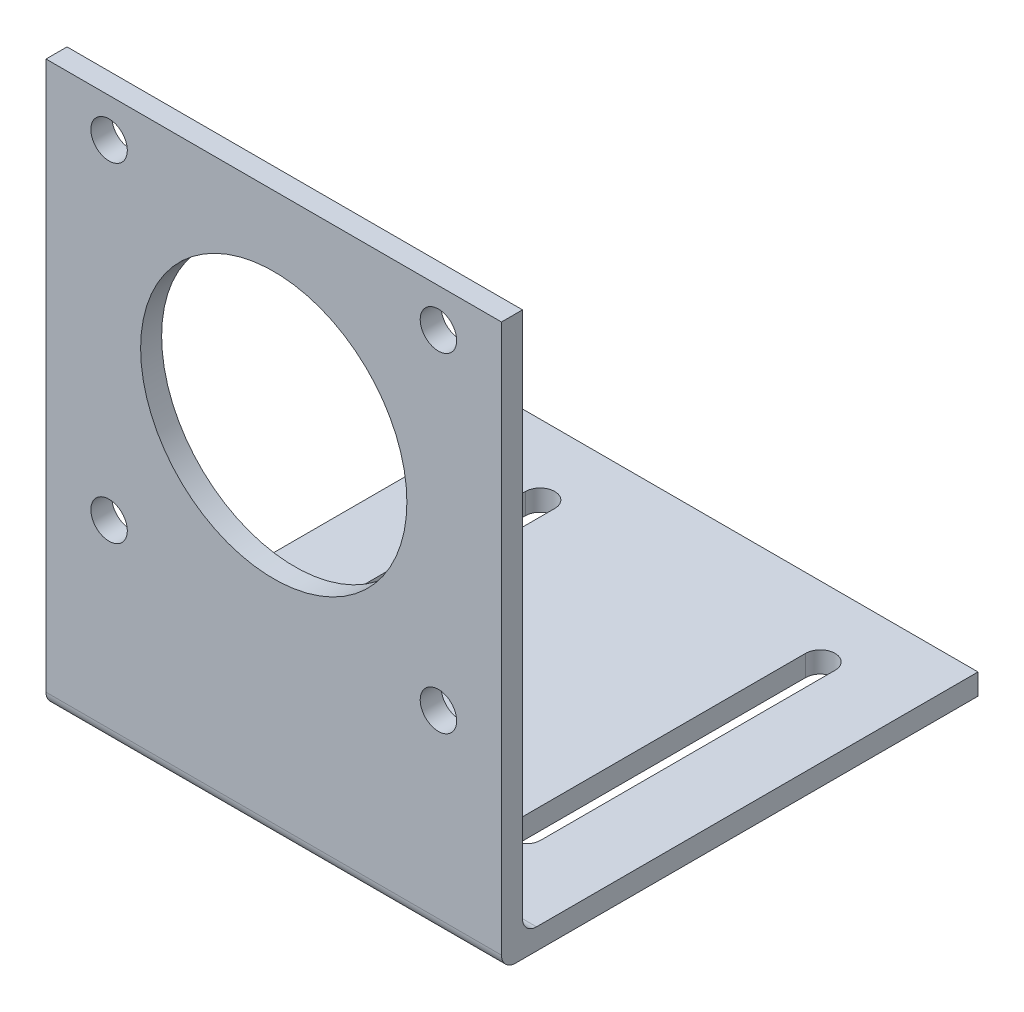
ISO-10303-21;
HEADER;
FILE_DESCRIPTION(('STEP AP214'),'2;1');
FILE_NAME('part.step','',(''),(''),'','','');
FILE_SCHEMA(('AUTOMOTIVE_DESIGN { 1 0 10303 214 1 1 1 1 }'));
ENDSEC;
DATA;
#1=APPLICATION_CONTEXT('core data for automotive mechanical design processes');
#2=APPLICATION_PROTOCOL_DEFINITION('international standard','automotive_design',2000,#1);
#3=PRODUCT_CONTEXT('',#1,'mechanical');
#4=PRODUCT('Part','Part','',(#3));
#5=PRODUCT_RELATED_PRODUCT_CATEGORY('part','',(#4));
#6=PRODUCT_DEFINITION_FORMATION('','',#4);
#7=PRODUCT_DEFINITION_CONTEXT('part definition',#1,'design');
#8=PRODUCT_DEFINITION('design','',#6,#7);
#9=PRODUCT_DEFINITION_SHAPE('','',#8);
#10=(LENGTH_UNIT() NAMED_UNIT(*) SI_UNIT(.MILLI.,.METRE.));
#11=(NAMED_UNIT(*) PLANE_ANGLE_UNIT() SI_UNIT($,.RADIAN.));
#12=(NAMED_UNIT(*) SI_UNIT($,.STERADIAN.) SOLID_ANGLE_UNIT());
#13=UNCERTAINTY_MEASURE_WITH_UNIT(LENGTH_MEASURE(1.E-05),#10,'distance_accuracy_value','');
#14=(GEOMETRIC_REPRESENTATION_CONTEXT(3) GLOBAL_UNCERTAINTY_ASSIGNED_CONTEXT((#13)) GLOBAL_UNIT_ASSIGNED_CONTEXT((#10,
#11,#12)) REPRESENTATION_CONTEXT('',''));
#15=CARTESIAN_POINT('',(0.,0.,0.));
#16=DIRECTION('',(0.,0.,1.));
#17=DIRECTION('',(1.,0.,0.));
#18=AXIS2_PLACEMENT_3D('',#15,#16,#17);
#19=CARTESIAN_POINT('',(65.,0.,0.));
#20=DIRECTION('',(0.,0.,1.));
#21=DIRECTION('',(1.,0.,0.));
#22=AXIS2_PLACEMENT_3D('',#19,#20,#21);
#23=PLANE('',#22);
#24=DIRECTION('',(0.,1.,0.));
#25=VECTOR('',#24,1.);
#26=CARTESIAN_POINT('',(0.,0.,0.));
#27=LINE('',#26,#25);
#28=CARTESIAN_POINT('',(0.,0.,0.));
#29=VERTEX_POINT('',#28);
#30=CARTESIAN_POINT('',(0.,3.,0.));
#31=VERTEX_POINT('',#30);
#32=EDGE_CURVE('E239',#29,#31,#27,.T.);
#33=ORIENTED_EDGE('',*,*,#32,.T.);
#34=DIRECTION('',(-1.,0.,0.));
#35=VECTOR('',#34,1.);
#36=CARTESIAN_POINT('',(65.,3.,0.));
#37=LINE('',#36,#35);
#38=CARTESIAN_POINT('',(65.,3.,0.));
#39=VERTEX_POINT('',#38);
#40=EDGE_CURVE('E11',#39,#31,#37,.T.);
#41=ORIENTED_EDGE('',*,*,#40,.F.);
#42=DIRECTION('',(0.,1.,0.));
#43=VECTOR('',#42,1.);
#44=CARTESIAN_POINT('',(65.,0.,0.));
#45=LINE('',#44,#43);
#46=CARTESIAN_POINT('',(65.,0.,0.));
#47=VERTEX_POINT('',#46);
#48=EDGE_CURVE('E249',#47,#39,#45,.T.);
#49=ORIENTED_EDGE('',*,*,#48,.F.);
#50=DIRECTION('',(-1.,0.,0.));
#51=VECTOR('',#50,1.);
#52=CARTESIAN_POINT('',(65.,0.,0.));
#53=LINE('',#52,#51);
#54=EDGE_CURVE('E275',#47,#29,#53,.T.);
#55=ORIENTED_EDGE('',*,*,#54,.T.);
#56=EDGE_LOOP('',(#33,#41,#49,#55));
#57=FACE_BOUND('',#56,.T.);
#58=ADVANCED_FACE('F39',(#57),#23,.F.);
#59=CARTESIAN_POINT('',(65.,3.,63.));
#60=DIRECTION('',(0.,-1.,0.));
#61=DIRECTION('',(0.,0.,-1.));
#62=AXIS2_PLACEMENT_3D('',#59,#60,#61);
#63=PLANE('',#62);
#64=DIRECTION('',(0.,0.,1.));
#65=VECTOR('',#64,1.);
#66=CARTESIAN_POINT('',(10.4,3.,52.));
#67=LINE('',#66,#65);
#68=CARTESIAN_POINT('',(10.4,3.,10.));
#69=VERTEX_POINT('',#68);
#70=CARTESIAN_POINT('',(10.4,3.,52.));
#71=VERTEX_POINT('',#70);
#72=EDGE_CURVE('E189',#69,#71,#67,.T.);
#73=ORIENTED_EDGE('',*,*,#72,.F.);
#74=CARTESIAN_POINT('',(12.5,3.,10.));
#75=DIRECTION('',(0.,1.,0.));
#76=DIRECTION('',(0.,0.,-1.));
#77=AXIS2_PLACEMENT_3D('',#74,#75,#76);
#78=CIRCLE('',#77,2.1);
#79=CARTESIAN_POINT('',(14.6,3.,10.));
#80=VERTEX_POINT('',#79);
#81=EDGE_CURVE('E54',#80,#69,#78,.T.);
#82=ORIENTED_EDGE('',*,*,#81,.F.);
#83=DIRECTION('',(0.,0.,-1.));
#84=VECTOR('',#83,1.);
#85=CARTESIAN_POINT('',(14.6,3.,52.));
#86=LINE('',#85,#84);
#87=CARTESIAN_POINT('',(14.6,3.,52.));
#88=VERTEX_POINT('',#87);
#89=EDGE_CURVE('E173',#88,#80,#86,.T.);
#90=ORIENTED_EDGE('',*,*,#89,.F.);
#91=CARTESIAN_POINT('',(12.5,3.,52.));
#92=DIRECTION('',(0.,1.,0.));
#93=DIRECTION('',(0.,0.,1.));
#94=AXIS2_PLACEMENT_3D('',#91,#92,#93);
#95=CIRCLE('',#94,2.1);
#96=EDGE_CURVE('E177',#71,#88,#95,.T.);
#97=ORIENTED_EDGE('',*,*,#96,.F.);
#98=EDGE_LOOP('',(#73,#82,#90,#97));
#99=FACE_BOUND('',#98,.T.);
#100=DIRECTION('',(0.,0.,-1.));
#101=VECTOR('',#100,1.);
#102=CARTESIAN_POINT('',(54.6,3.,52.));
#103=LINE('',#102,#101);
#104=CARTESIAN_POINT('',(54.6,3.,52.));
#105=VERTEX_POINT('',#104);
#106=CARTESIAN_POINT('',(54.6,3.,10.));
#107=VERTEX_POINT('',#106);
#108=EDGE_CURVE('E225',#105,#107,#103,.T.);
#109=ORIENTED_EDGE('',*,*,#108,.F.);
#110=CARTESIAN_POINT('',(52.5,3.,52.));
#111=DIRECTION('',(0.,1.,0.));
#112=DIRECTION('',(0.,0.,-1.));
#113=AXIS2_PLACEMENT_3D('',#110,#111,#112);
#114=CIRCLE('',#113,2.1);
#115=CARTESIAN_POINT('',(50.4,3.,52.));
#116=VERTEX_POINT('',#115);
#117=EDGE_CURVE('E199',#116,#105,#114,.T.);
#118=ORIENTED_EDGE('',*,*,#117,.F.);
#119=DIRECTION('',(0.,0.,1.));
#120=VECTOR('',#119,1.);
#121=CARTESIAN_POINT('',(50.4,3.,52.));
#122=LINE('',#121,#120);
#123=CARTESIAN_POINT('',(50.4,3.,10.));
#124=VERTEX_POINT('',#123);
#125=EDGE_CURVE('E210',#124,#116,#122,.T.);
#126=ORIENTED_EDGE('',*,*,#125,.F.);
#127=CARTESIAN_POINT('',(52.5,3.,10.));
#128=DIRECTION('',(0.,1.,0.));
#129=DIRECTION('',(0.,0.,1.));
#130=AXIS2_PLACEMENT_3D('',#127,#128,#129);
#131=CIRCLE('',#130,2.1);
#132=EDGE_CURVE('E229',#107,#124,#131,.T.);
#133=ORIENTED_EDGE('',*,*,#132,.F.);
#134=EDGE_LOOP('',(#109,#118,#126,#133));
#135=FACE_BOUND('',#134,.T.);
#136=DIRECTION('',(0.,0.,1.));
#137=VECTOR('',#136,1.);
#138=CARTESIAN_POINT('',(0.,3.,63.));
#139=LINE('',#138,#137);
#140=CARTESIAN_POINT('',(0.,3.,63.));
#141=VERTEX_POINT('',#140);
#142=EDGE_CURVE('E279',#31,#141,#139,.T.);
#143=ORIENTED_EDGE('',*,*,#142,.T.);
#144=DIRECTION('',(-1.,0.,0.));
#145=VECTOR('',#144,1.);
#146=CARTESIAN_POINT('',(65.,3.,63.));
#147=LINE('',#146,#145);
#148=CARTESIAN_POINT('',(65.,3.,63.));
#149=VERTEX_POINT('',#148);
#150=EDGE_CURVE('E47',#149,#141,#147,.T.);
#151=ORIENTED_EDGE('',*,*,#150,.F.);
#152=DIRECTION('',(0.,0.,1.));
#153=VECTOR('',#152,1.);
#154=CARTESIAN_POINT('',(65.,3.,63.));
#155=LINE('',#154,#153);
#156=EDGE_CURVE('E253',#39,#149,#155,.T.);
#157=ORIENTED_EDGE('',*,*,#156,.F.);
#158=ORIENTED_EDGE('',*,*,#40,.T.);
#159=EDGE_LOOP('',(#143,#151,#157,#158));
#160=FACE_BOUND('',#159,.T.);
#161=ADVANCED_FACE('F350',(#99,#135,#160),#63,.F.);
#162=CARTESIAN_POINT('',(65.,5.,63.));
#163=DIRECTION('',(-1.,0.,0.));
#164=DIRECTION('',(0.,0.,1.));
#165=AXIS2_PLACEMENT_3D('',#162,#163,#164);
#166=CYLINDRICAL_SURFACE('',#165,2.);
#167=CARTESIAN_POINT('',(0.,5.,63.));
#168=DIRECTION('',(-1.,0.,0.));
#169=DIRECTION('',(0.,0.,1.));
#170=AXIS2_PLACEMENT_3D('',#167,#168,#169);
#171=CIRCLE('',#170,2.);
#172=CARTESIAN_POINT('',(0.,5.00000000000001,65.));
#173=VERTEX_POINT('',#172);
#174=EDGE_CURVE('E282',#141,#173,#171,.T.);
#175=ORIENTED_EDGE('',*,*,#174,.T.);
#176=DIRECTION('',(-1.,0.,0.));
#177=VECTOR('',#176,1.);
#178=CARTESIAN_POINT('',(65.,5.00000000000001,65.));
#179=LINE('',#178,#177);
#180=CARTESIAN_POINT('',(65.,5.00000000000001,65.));
#181=VERTEX_POINT('',#180);
#182=EDGE_CURVE('E318',#181,#173,#179,.T.);
#183=ORIENTED_EDGE('',*,*,#182,.F.);
#184=CARTESIAN_POINT('',(65.,5.,63.));
#185=DIRECTION('',(-1.,0.,0.));
#186=DIRECTION('',(0.,0.,1.));
#187=AXIS2_PLACEMENT_3D('',#184,#185,#186);
#188=CIRCLE('',#187,2.);
#189=EDGE_CURVE('E257',#149,#181,#188,.T.);
#190=ORIENTED_EDGE('',*,*,#189,.F.);
#191=ORIENTED_EDGE('',*,*,#150,.T.);
#192=EDGE_LOOP('',(#175,#183,#190,#191));
#193=FACE_BOUND('',#192,.T.);
#194=ADVANCED_FACE('F327',(#193),#166,.F.);
#195=CARTESIAN_POINT('',(65.,80.25,65.));
#196=DIRECTION('',(0.,0.,1.));
#197=DIRECTION('',(1.,0.,0.));
#198=AXIS2_PLACEMENT_3D('',#195,#196,#197);
#199=PLANE('',#198);
#200=CARTESIAN_POINT('',(8.99999999999998,27.75,65.));
#201=DIRECTION('',(0.,0.,-1.));
#202=DIRECTION('',(-1.,0.,0.));
#203=AXIS2_PLACEMENT_3D('',#200,#201,#202);
#204=CIRCLE('',#203,2.6);
#205=CARTESIAN_POINT('',(6.39999999999998,27.75,65.));
#206=VERTEX_POINT('',#205);
#207=EDGE_CURVE('E392',#206,#206,#204,.T.);
#208=ORIENTED_EDGE('',*,*,#207,.F.);
#209=EDGE_LOOP('',(#208));
#210=FACE_BOUND('',#209,.T.);
#211=CARTESIAN_POINT('',(56.,27.75,65.));
#212=DIRECTION('',(0.,0.,-1.));
#213=DIRECTION('',(-1.,0.,0.));
#214=AXIS2_PLACEMENT_3D('',#211,#212,#213);
#215=CIRCLE('',#214,2.6);
#216=CARTESIAN_POINT('',(53.4,27.75,65.));
#217=VERTEX_POINT('',#216);
#218=EDGE_CURVE('E396',#217,#217,#215,.T.);
#219=ORIENTED_EDGE('',*,*,#218,.F.);
#220=EDGE_LOOP('',(#219));
#221=FACE_BOUND('',#220,.T.);
#222=CARTESIAN_POINT('',(56.,74.75,65.));
#223=DIRECTION('',(0.,0.,-1.));
#224=DIRECTION('',(-1.,0.,0.));
#225=AXIS2_PLACEMENT_3D('',#222,#223,#224);
#226=CIRCLE('',#225,2.6);
#227=CARTESIAN_POINT('',(53.4,74.75,65.));
#228=VERTEX_POINT('',#227);
#229=EDGE_CURVE('E400',#228,#228,#226,.T.);
#230=ORIENTED_EDGE('',*,*,#229,.F.);
#231=EDGE_LOOP('',(#230));
#232=FACE_BOUND('',#231,.T.);
#233=CARTESIAN_POINT('',(8.99999999999998,74.75,65.));
#234=DIRECTION('',(0.,0.,-1.));
#235=DIRECTION('',(-1.,0.,0.));
#236=AXIS2_PLACEMENT_3D('',#233,#234,#235);
#237=CIRCLE('',#236,2.6);
#238=CARTESIAN_POINT('',(6.39999999999998,74.75,65.));
#239=VERTEX_POINT('',#238);
#240=EDGE_CURVE('E404',#239,#239,#237,.T.);
#241=ORIENTED_EDGE('',*,*,#240,.F.);
#242=EDGE_LOOP('',(#241));
#243=FACE_BOUND('',#242,.T.);
#244=CARTESIAN_POINT('',(32.5,51.25,65.));
#245=DIRECTION('',(0.,0.,-1.));
#246=DIRECTION('',(-1.,0.,0.));
#247=AXIS2_PLACEMENT_3D('',#244,#245,#246);
#248=CIRCLE('',#247,19.);
#249=CARTESIAN_POINT('',(13.5,51.25,65.));
#250=VERTEX_POINT('',#249);
#251=EDGE_CURVE('E180',#250,#250,#248,.T.);
#252=ORIENTED_EDGE('',*,*,#251,.F.);
#253=EDGE_LOOP('',(#252));
#254=FACE_BOUND('',#253,.T.);
#255=DIRECTION('',(0.,1.,0.));
#256=VECTOR('',#255,1.);
#257=CARTESIAN_POINT('',(0.,80.25,65.));
#258=LINE('',#257,#256);
#259=CARTESIAN_POINT('',(0.,80.25,65.));
#260=VERTEX_POINT('',#259);
#261=EDGE_CURVE('E285',#173,#260,#258,.T.);
#262=ORIENTED_EDGE('',*,*,#261,.T.);
#263=DIRECTION('',(-1.,0.,0.));
#264=VECTOR('',#263,1.);
#265=CARTESIAN_POINT('',(65.,80.25,65.));
#266=LINE('',#265,#264);
#267=CARTESIAN_POINT('',(65.,80.25,65.));
#268=VERTEX_POINT('',#267);
#269=EDGE_CURVE('E314',#268,#260,#266,.T.);
#270=ORIENTED_EDGE('',*,*,#269,.F.);
#271=DIRECTION('',(0.,1.,0.));
#272=VECTOR('',#271,1.);
#273=CARTESIAN_POINT('',(65.,80.25,65.));
#274=LINE('',#273,#272);
#275=EDGE_CURVE('E260',#181,#268,#274,.T.);
#276=ORIENTED_EDGE('',*,*,#275,.F.);
#277=ORIENTED_EDGE('',*,*,#182,.T.);
#278=EDGE_LOOP('',(#262,#270,#276,#277));
#279=FACE_BOUND('',#278,.T.);
#280=ADVANCED_FACE('F338',(#210,#221,#232,#243,#254,#279),#199,.F.);
#281=CARTESIAN_POINT('',(65.,80.25,68.));
#282=DIRECTION('',(0.,-1.,0.));
#283=DIRECTION('',(0.,0.,-1.));
#284=AXIS2_PLACEMENT_3D('',#281,#282,#283);
#285=PLANE('',#284);
#286=DIRECTION('',(0.,0.,1.));
#287=VECTOR('',#286,1.);
#288=CARTESIAN_POINT('',(0.,80.25,68.));
#289=LINE('',#288,#287);
#290=CARTESIAN_POINT('',(0.,80.25,68.));
#291=VERTEX_POINT('',#290);
#292=EDGE_CURVE('E288',#260,#291,#289,.T.);
#293=ORIENTED_EDGE('',*,*,#292,.T.);
#294=DIRECTION('',(-1.,0.,0.));
#295=VECTOR('',#294,1.);
#296=CARTESIAN_POINT('',(65.,80.25,68.));
#297=LINE('',#296,#295);
#298=CARTESIAN_POINT('',(65.,80.25,68.));
#299=VERTEX_POINT('',#298);
#300=EDGE_CURVE('E310',#299,#291,#297,.T.);
#301=ORIENTED_EDGE('',*,*,#300,.F.);
#302=DIRECTION('',(0.,0.,1.));
#303=VECTOR('',#302,1.);
#304=CARTESIAN_POINT('',(65.,80.25,68.));
#305=LINE('',#304,#303);
#306=EDGE_CURVE('E263',#268,#299,#305,.T.);
#307=ORIENTED_EDGE('',*,*,#306,.F.);
#308=ORIENTED_EDGE('',*,*,#269,.T.);
#309=EDGE_LOOP('',(#293,#301,#307,#308));
#310=FACE_BOUND('',#309,.T.);
#311=ADVANCED_FACE('F342',(#310),#285,.F.);
#312=CARTESIAN_POINT('',(65.,2.00000000000001,68.));
#313=DIRECTION('',(0.,0.,-1.));
#314=DIRECTION('',(-1.,0.,0.));
#315=AXIS2_PLACEMENT_3D('',#312,#313,#314);
#316=PLANE('',#315);
#317=CARTESIAN_POINT('',(8.99999999999998,27.75,68.));
#318=DIRECTION('',(0.,0.,-1.));
#319=DIRECTION('',(-1.,0.,0.));
#320=AXIS2_PLACEMENT_3D('',#317,#318,#319);
#321=CIRCLE('',#320,2.6);
#322=CARTESIAN_POINT('',(6.39999999999998,27.75,68.));
#323=VERTEX_POINT('',#322);
#324=EDGE_CURVE('E429',#323,#323,#321,.T.);
#325=ORIENTED_EDGE('',*,*,#324,.T.);
#326=EDGE_LOOP('',(#325));
#327=FACE_BOUND('',#326,.T.);
#328=CARTESIAN_POINT('',(56.,27.75,68.));
#329=DIRECTION('',(0.,0.,-1.));
#330=DIRECTION('',(-1.,0.,0.));
#331=AXIS2_PLACEMENT_3D('',#328,#329,#330);
#332=CIRCLE('',#331,2.6);
#333=CARTESIAN_POINT('',(53.4,27.75,68.));
#334=VERTEX_POINT('',#333);
#335=EDGE_CURVE('E423',#334,#334,#332,.T.);
#336=ORIENTED_EDGE('',*,*,#335,.T.);
#337=EDGE_LOOP('',(#336));
#338=FACE_BOUND('',#337,.T.);
#339=CARTESIAN_POINT('',(56.,74.75,68.));
#340=DIRECTION('',(0.,0.,-1.));
#341=DIRECTION('',(-1.,0.,0.));
#342=AXIS2_PLACEMENT_3D('',#339,#340,#341);
#343=CIRCLE('',#342,2.6);
#344=CARTESIAN_POINT('',(53.4,74.75,68.));
#345=VERTEX_POINT('',#344);
#346=EDGE_CURVE('E418',#345,#345,#343,.T.);
#347=ORIENTED_EDGE('',*,*,#346,.T.);
#348=EDGE_LOOP('',(#347));
#349=FACE_BOUND('',#348,.T.);
#350=CARTESIAN_POINT('',(8.99999999999998,74.75,68.));
#351=DIRECTION('',(0.,0.,-1.));
#352=DIRECTION('',(-1.,0.,0.));
#353=AXIS2_PLACEMENT_3D('',#350,#351,#352);
#354=CIRCLE('',#353,2.6);
#355=CARTESIAN_POINT('',(6.39999999999998,74.75,68.));
#356=VERTEX_POINT('',#355);
#357=EDGE_CURVE('E409',#356,#356,#354,.T.);
#358=ORIENTED_EDGE('',*,*,#357,.T.);
#359=EDGE_LOOP('',(#358));
#360=FACE_BOUND('',#359,.T.);
#361=CARTESIAN_POINT('',(32.5,51.25,68.));
#362=DIRECTION('',(0.,0.,-1.));
#363=DIRECTION('',(-1.,0.,0.));
#364=AXIS2_PLACEMENT_3D('',#361,#362,#363);
#365=CIRCLE('',#364,19.);
#366=CARTESIAN_POINT('',(13.5,51.25,68.));
#367=VERTEX_POINT('',#366);
#368=EDGE_CURVE('E190',#367,#367,#365,.T.);
#369=ORIENTED_EDGE('',*,*,#368,.T.);
#370=EDGE_LOOP('',(#369));
#371=FACE_BOUND('',#370,.T.);
#372=DIRECTION('',(0.,-1.,0.));
#373=VECTOR('',#372,1.);
#374=CARTESIAN_POINT('',(0.,2.00000000000001,68.));
#375=LINE('',#374,#373);
#376=CARTESIAN_POINT('',(0.,2.00000000000001,68.));
#377=VERTEX_POINT('',#376);
#378=EDGE_CURVE('E291',#291,#377,#375,.T.);
#379=ORIENTED_EDGE('',*,*,#378,.T.);
#380=DIRECTION('',(-1.,0.,0.));
#381=VECTOR('',#380,1.);
#382=CARTESIAN_POINT('',(65.,2.00000000000001,68.));
#383=LINE('',#382,#381);
#384=CARTESIAN_POINT('',(65.,2.00000000000001,68.));
#385=VERTEX_POINT('',#384);
#386=EDGE_CURVE('E306',#385,#377,#383,.T.);
#387=ORIENTED_EDGE('',*,*,#386,.F.);
#388=DIRECTION('',(0.,-1.,0.));
#389=VECTOR('',#388,1.);
#390=CARTESIAN_POINT('',(65.,2.00000000000001,68.));
#391=LINE('',#390,#389);
#392=EDGE_CURVE('E266',#299,#385,#391,.T.);
#393=ORIENTED_EDGE('',*,*,#392,.F.);
#394=ORIENTED_EDGE('',*,*,#300,.T.);
#395=EDGE_LOOP('',(#379,#387,#393,#394));
#396=FACE_BOUND('',#395,.T.);
#397=ADVANCED_FACE('F362',(#327,#338,#349,#360,#371,#396),#316,.F.);
#398=CARTESIAN_POINT('',(65.,1.99999999999999,66.));
#399=DIRECTION('',(-1.,0.,0.));
#400=DIRECTION('',(0.,0.,1.));
#401=AXIS2_PLACEMENT_3D('',#398,#399,#400);
#402=CYLINDRICAL_SURFACE('',#401,2.);
#403=CARTESIAN_POINT('',(0.,1.99999999999999,66.));
#404=DIRECTION('',(1.,0.,0.));
#405=DIRECTION('',(0.,0.,1.));
#406=AXIS2_PLACEMENT_3D('',#403,#404,#405);
#407=CIRCLE('',#406,2.);
#408=CARTESIAN_POINT('',(0.,0.,66.));
#409=VERTEX_POINT('',#408);
#410=EDGE_CURVE('E294',#377,#409,#407,.T.);
#411=ORIENTED_EDGE('',*,*,#410,.T.);
#412=DIRECTION('',(-1.,0.,0.));
#413=VECTOR('',#412,1.);
#414=CARTESIAN_POINT('',(65.,0.,66.));
#415=LINE('',#414,#413);
#416=CARTESIAN_POINT('',(65.,0.,66.));
#417=VERTEX_POINT('',#416);
#418=EDGE_CURVE('E302',#417,#409,#415,.T.);
#419=ORIENTED_EDGE('',*,*,#418,.F.);
#420=CARTESIAN_POINT('',(65.,1.99999999999999,66.));
#421=DIRECTION('',(1.,0.,0.));
#422=DIRECTION('',(0.,0.,1.));
#423=AXIS2_PLACEMENT_3D('',#420,#421,#422);
#424=CIRCLE('',#423,2.);
#425=EDGE_CURVE('E269',#385,#417,#424,.T.);
#426=ORIENTED_EDGE('',*,*,#425,.F.);
#427=ORIENTED_EDGE('',*,*,#386,.T.);
#428=EDGE_LOOP('',(#411,#419,#426,#427));
#429=FACE_BOUND('',#428,.T.);
#430=ADVANCED_FACE('F360',(#429),#402,.T.);
#431=CARTESIAN_POINT('',(65.,0.,0.));
#432=DIRECTION('',(0.,1.,0.));
#433=DIRECTION('',(0.,0.,1.));
#434=AXIS2_PLACEMENT_3D('',#431,#432,#433);
#435=PLANE('',#434);
#436=DIRECTION('',(0.,0.,-1.));
#437=VECTOR('',#436,1.);
#438=CARTESIAN_POINT('',(14.6,0.,52.));
#439=LINE('',#438,#437);
#440=CARTESIAN_POINT('',(14.6,0.,52.));
#441=VERTEX_POINT('',#440);
#442=CARTESIAN_POINT('',(14.6,0.,10.));
#443=VERTEX_POINT('',#442);
#444=EDGE_CURVE('E161',#441,#443,#439,.T.);
#445=ORIENTED_EDGE('',*,*,#444,.T.);
#446=CARTESIAN_POINT('',(12.5,0.,10.));
#447=DIRECTION('',(0.,1.,0.));
#448=DIRECTION('',(0.,0.,-1.));
#449=AXIS2_PLACEMENT_3D('',#446,#447,#448);
#450=CIRCLE('',#449,2.1);
#451=CARTESIAN_POINT('',(10.4,0.,10.));
#452=VERTEX_POINT('',#451);
#453=EDGE_CURVE('E154',#443,#452,#450,.T.);
#454=ORIENTED_EDGE('',*,*,#453,.T.);
#455=DIRECTION('',(0.,0.,1.));
#456=VECTOR('',#455,1.);
#457=CARTESIAN_POINT('',(10.4,0.,52.));
#458=LINE('',#457,#456);
#459=CARTESIAN_POINT('',(10.4,0.,52.));
#460=VERTEX_POINT('',#459);
#461=EDGE_CURVE('E164',#452,#460,#458,.T.);
#462=ORIENTED_EDGE('',*,*,#461,.T.);
#463=CARTESIAN_POINT('',(12.5,0.,52.));
#464=DIRECTION('',(0.,1.,0.));
#465=DIRECTION('',(0.,0.,1.));
#466=AXIS2_PLACEMENT_3D('',#463,#464,#465);
#467=CIRCLE('',#466,2.1);
#468=EDGE_CURVE('E62',#460,#441,#467,.T.);
#469=ORIENTED_EDGE('',*,*,#468,.T.);
#470=EDGE_LOOP('',(#445,#454,#462,#469));
#471=FACE_BOUND('',#470,.T.);
#472=DIRECTION('',(0.,0.,1.));
#473=VECTOR('',#472,1.);
#474=CARTESIAN_POINT('',(50.4,0.,52.));
#475=LINE('',#474,#473);
#476=CARTESIAN_POINT('',(50.4,0.,10.));
#477=VERTEX_POINT('',#476);
#478=CARTESIAN_POINT('',(50.4,0.,52.));
#479=VERTEX_POINT('',#478);
#480=EDGE_CURVE('E218',#477,#479,#475,.T.);
#481=ORIENTED_EDGE('',*,*,#480,.T.);
#482=CARTESIAN_POINT('',(52.5,0.,52.));
#483=DIRECTION('',(0.,1.,0.));
#484=DIRECTION('',(0.,0.,-1.));
#485=AXIS2_PLACEMENT_3D('',#482,#483,#484);
#486=CIRCLE('',#485,2.1);
#487=CARTESIAN_POINT('',(54.6,0.,52.));
#488=VERTEX_POINT('',#487);
#489=EDGE_CURVE('E205',#479,#488,#486,.T.);
#490=ORIENTED_EDGE('',*,*,#489,.T.);
#491=DIRECTION('',(0.,0.,-1.));
#492=VECTOR('',#491,1.);
#493=CARTESIAN_POINT('',(54.6,0.,52.));
#494=LINE('',#493,#492);
#495=CARTESIAN_POINT('',(54.6,0.,10.));
#496=VERTEX_POINT('',#495);
#497=EDGE_CURVE('E209',#488,#496,#494,.T.);
#498=ORIENTED_EDGE('',*,*,#497,.T.);
#499=CARTESIAN_POINT('',(52.5,0.,10.));
#500=DIRECTION('',(0.,1.,0.));
#501=DIRECTION('',(0.,0.,1.));
#502=AXIS2_PLACEMENT_3D('',#499,#500,#501);
#503=CIRCLE('',#502,2.1);
#504=EDGE_CURVE('E214',#496,#477,#503,.T.);
#505=ORIENTED_EDGE('',*,*,#504,.T.);
#506=EDGE_LOOP('',(#481,#490,#498,#505));
#507=FACE_BOUND('',#506,.T.);
#508=DIRECTION('',(0.,0.,-1.));
#509=VECTOR('',#508,1.);
#510=CARTESIAN_POINT('',(0.,0.,0.));
#511=LINE('',#510,#509);
#512=EDGE_CURVE('E254',#409,#29,#511,.T.);
#513=ORIENTED_EDGE('',*,*,#512,.T.);
#514=ORIENTED_EDGE('',*,*,#54,.F.);
#515=DIRECTION('',(0.,0.,-1.));
#516=VECTOR('',#515,1.);
#517=CARTESIAN_POINT('',(65.,0.,0.));
#518=LINE('',#517,#516);
#519=EDGE_CURVE('E272',#417,#47,#518,.T.);
#520=ORIENTED_EDGE('',*,*,#519,.F.);
#521=ORIENTED_EDGE('',*,*,#418,.T.);
#522=EDGE_LOOP('',(#513,#514,#520,#521));
#523=FACE_BOUND('',#522,.T.);
#524=ADVANCED_FACE('F169',(#471,#507,#523),#435,.F.);
#525=CARTESIAN_POINT('',(65.,5.,63.));
#526=DIRECTION('',(-1.,0.,0.));
#527=DIRECTION('',(0.,0.,1.));
#528=AXIS2_PLACEMENT_3D('',#525,#526,#527);
#529=PLANE('',#528);
#530=ORIENTED_EDGE('',*,*,#48,.T.);
#531=ORIENTED_EDGE('',*,*,#156,.T.);
#532=ORIENTED_EDGE('',*,*,#189,.T.);
#533=ORIENTED_EDGE('',*,*,#275,.T.);
#534=ORIENTED_EDGE('',*,*,#306,.T.);
#535=ORIENTED_EDGE('',*,*,#392,.T.);
#536=ORIENTED_EDGE('',*,*,#425,.T.);
#537=ORIENTED_EDGE('',*,*,#519,.T.);
#538=EDGE_LOOP('',(#530,#531,#532,#533,#534,#535,#536,#537));
#539=FACE_BOUND('',#538,.T.);
#540=ADVANCED_FACE('F346',(#539),#529,.F.);
#541=CARTESIAN_POINT('',(0.,5.,63.));
#542=DIRECTION('',(-1.,0.,0.));
#543=DIRECTION('',(0.,0.,1.));
#544=AXIS2_PLACEMENT_3D('',#541,#542,#543);
#545=PLANE('',#544);
#546=ORIENTED_EDGE('',*,*,#32,.F.);
#547=ORIENTED_EDGE('',*,*,#512,.F.);
#548=ORIENTED_EDGE('',*,*,#410,.F.);
#549=ORIENTED_EDGE('',*,*,#378,.F.);
#550=ORIENTED_EDGE('',*,*,#292,.F.);
#551=ORIENTED_EDGE('',*,*,#261,.F.);
#552=ORIENTED_EDGE('',*,*,#174,.F.);
#553=ORIENTED_EDGE('',*,*,#142,.F.);
#554=EDGE_LOOP('',(#546,#547,#548,#549,#550,#551,#552,#553));
#555=FACE_BOUND('',#554,.T.);
#556=ADVANCED_FACE('F333',(#555),#545,.T.);
#557=CARTESIAN_POINT('',(52.5,0.,52.));
#558=DIRECTION('',(0.,1.,0.));
#559=DIRECTION('',(0.,0.,1.));
#560=AXIS2_PLACEMENT_3D('',#557,#558,#559);
#561=CYLINDRICAL_SURFACE('',#560,2.1);
#562=ORIENTED_EDGE('',*,*,#117,.T.);
#563=DIRECTION('',(0.,1.,0.));
#564=VECTOR('',#563,1.);
#565=CARTESIAN_POINT('',(54.6,0.,52.));
#566=LINE('',#565,#564);
#567=EDGE_CURVE('E222',#488,#105,#566,.T.);
#568=ORIENTED_EDGE('',*,*,#567,.F.);
#569=ORIENTED_EDGE('',*,*,#489,.F.);
#570=DIRECTION('',(0.,1.,0.));
#571=VECTOR('',#570,1.);
#572=CARTESIAN_POINT('',(50.4,0.,52.));
#573=LINE('',#572,#571);
#574=EDGE_CURVE('E236',#479,#116,#573,.T.);
#575=ORIENTED_EDGE('',*,*,#574,.T.);
#576=EDGE_LOOP('',(#562,#568,#569,#575));
#577=FACE_BOUND('',#576,.T.);
#578=ADVANCED_FACE('F477',(#577),#561,.F.);
#579=CARTESIAN_POINT('',(50.4,0.,52.));
#580=DIRECTION('',(-1.,0.,0.));
#581=DIRECTION('',(0.,0.,1.));
#582=AXIS2_PLACEMENT_3D('',#579,#580,#581);
#583=PLANE('',#582);
#584=ORIENTED_EDGE('',*,*,#125,.T.);
#585=ORIENTED_EDGE('',*,*,#574,.F.);
#586=ORIENTED_EDGE('',*,*,#480,.F.);
#587=DIRECTION('',(0.,1.,0.));
#588=VECTOR('',#587,1.);
#589=CARTESIAN_POINT('',(50.4,0.,10.));
#590=LINE('',#589,#588);
#591=EDGE_CURVE('E240',#477,#124,#590,.T.);
#592=ORIENTED_EDGE('',*,*,#591,.T.);
#593=EDGE_LOOP('',(#584,#585,#586,#592));
#594=FACE_BOUND('',#593,.T.);
#595=ADVANCED_FACE('F473',(#594),#583,.F.);
#596=CARTESIAN_POINT('',(52.5,0.,10.));
#597=DIRECTION('',(0.,1.,0.));
#598=DIRECTION('',(0.,0.,1.));
#599=AXIS2_PLACEMENT_3D('',#596,#597,#598);
#600=CYLINDRICAL_SURFACE('',#599,2.1);
#601=ORIENTED_EDGE('',*,*,#132,.T.);
#602=ORIENTED_EDGE('',*,*,#591,.F.);
#603=ORIENTED_EDGE('',*,*,#504,.F.);
#604=DIRECTION('',(0.,1.,0.));
#605=VECTOR('',#604,1.);
#606=CARTESIAN_POINT('',(54.6,0.,10.));
#607=LINE('',#606,#605);
#608=EDGE_CURVE('E243',#496,#107,#607,.T.);
#609=ORIENTED_EDGE('',*,*,#608,.T.);
#610=EDGE_LOOP('',(#601,#602,#603,#609));
#611=FACE_BOUND('',#610,.T.);
#612=ADVANCED_FACE('F476',(#611),#600,.F.);
#613=CARTESIAN_POINT('',(54.6,0.,52.));
#614=DIRECTION('',(1.,0.,0.));
#615=DIRECTION('',(0.,0.,-1.));
#616=AXIS2_PLACEMENT_3D('',#613,#614,#615);
#617=PLANE('',#616);
#618=ORIENTED_EDGE('',*,*,#108,.T.);
#619=ORIENTED_EDGE('',*,*,#608,.F.);
#620=ORIENTED_EDGE('',*,*,#497,.F.);
#621=ORIENTED_EDGE('',*,*,#567,.T.);
#622=EDGE_LOOP('',(#618,#619,#620,#621));
#623=FACE_BOUND('',#622,.T.);
#624=ADVANCED_FACE('F472',(#623),#617,.F.);
#625=CARTESIAN_POINT('',(12.5,0.,10.));
#626=DIRECTION('',(0.,1.,0.));
#627=DIRECTION('',(0.,0.,1.));
#628=AXIS2_PLACEMENT_3D('',#625,#626,#627);
#629=CYLINDRICAL_SURFACE('',#628,2.1);
#630=ORIENTED_EDGE('',*,*,#81,.T.);
#631=DIRECTION('',(0.,1.,0.));
#632=VECTOR('',#631,1.);
#633=CARTESIAN_POINT('',(10.4,0.,10.));
#634=LINE('',#633,#632);
#635=EDGE_CURVE('E150',#452,#69,#634,.T.);
#636=ORIENTED_EDGE('',*,*,#635,.F.);
#637=ORIENTED_EDGE('',*,*,#453,.F.);
#638=DIRECTION('',(0.,1.,0.));
#639=VECTOR('',#638,1.);
#640=CARTESIAN_POINT('',(14.6,0.,10.));
#641=LINE('',#640,#639);
#642=EDGE_CURVE('E196',#443,#80,#641,.T.);
#643=ORIENTED_EDGE('',*,*,#642,.T.);
#644=EDGE_LOOP('',(#630,#636,#637,#643));
#645=FACE_BOUND('',#644,.T.);
#646=ADVANCED_FACE('F152',(#645),#629,.F.);
#647=CARTESIAN_POINT('',(14.6,0.,52.));
#648=DIRECTION('',(1.,0.,0.));
#649=DIRECTION('',(0.,0.,-1.));
#650=AXIS2_PLACEMENT_3D('',#647,#648,#649);
#651=PLANE('',#650);
#652=ORIENTED_EDGE('',*,*,#89,.T.);
#653=ORIENTED_EDGE('',*,*,#642,.F.);
#654=ORIENTED_EDGE('',*,*,#444,.F.);
#655=DIRECTION('',(0.,1.,0.));
#656=VECTOR('',#655,1.);
#657=CARTESIAN_POINT('',(14.6,0.,52.));
#658=LINE('',#657,#656);
#659=EDGE_CURVE('E200',#441,#88,#658,.T.);
#660=ORIENTED_EDGE('',*,*,#659,.T.);
#661=EDGE_LOOP('',(#652,#653,#654,#660));
#662=FACE_BOUND('',#661,.T.);
#663=ADVANCED_FACE('F461',(#662),#651,.F.);
#664=CARTESIAN_POINT('',(12.5,0.,52.));
#665=DIRECTION('',(0.,1.,0.));
#666=DIRECTION('',(0.,0.,1.));
#667=AXIS2_PLACEMENT_3D('',#664,#665,#666);
#668=CYLINDRICAL_SURFACE('',#667,2.1);
#669=ORIENTED_EDGE('',*,*,#96,.T.);
#670=ORIENTED_EDGE('',*,*,#659,.F.);
#671=ORIENTED_EDGE('',*,*,#468,.F.);
#672=DIRECTION('',(0.,1.,0.));
#673=VECTOR('',#672,1.);
#674=CARTESIAN_POINT('',(10.4,0.,52.));
#675=LINE('',#674,#673);
#676=EDGE_CURVE('E160',#460,#71,#675,.T.);
#677=ORIENTED_EDGE('',*,*,#676,.T.);
#678=EDGE_LOOP('',(#669,#670,#671,#677));
#679=FACE_BOUND('',#678,.T.);
#680=ADVANCED_FACE('F464',(#679),#668,.F.);
#681=CARTESIAN_POINT('',(10.4,0.,52.));
#682=DIRECTION('',(-1.,0.,0.));
#683=DIRECTION('',(0.,0.,1.));
#684=AXIS2_PLACEMENT_3D('',#681,#682,#683);
#685=PLANE('',#684);
#686=ORIENTED_EDGE('',*,*,#72,.T.);
#687=ORIENTED_EDGE('',*,*,#676,.F.);
#688=ORIENTED_EDGE('',*,*,#461,.F.);
#689=ORIENTED_EDGE('',*,*,#635,.T.);
#690=EDGE_LOOP('',(#686,#687,#688,#689));
#691=FACE_BOUND('',#690,.T.);
#692=ADVANCED_FACE('F165',(#691),#685,.F.);
#693=CARTESIAN_POINT('',(32.5,51.25,68.));
#694=DIRECTION('',(0.,0.,-1.));
#695=DIRECTION('',(-1.,0.,0.));
#696=AXIS2_PLACEMENT_3D('',#693,#694,#695);
#697=CYLINDRICAL_SURFACE('',#696,19.);
#698=ORIENTED_EDGE('',*,*,#368,.F.);
#699=EDGE_LOOP('',(#698));
#700=FACE_BOUND('',#699,.T.);
#701=ORIENTED_EDGE('',*,*,#251,.T.);
#702=EDGE_LOOP('',(#701));
#703=FACE_BOUND('',#702,.T.);
#704=ADVANCED_FACE('F456',(#700,#703),#697,.F.);
#705=CARTESIAN_POINT('',(8.99999999999998,74.75,68.));
#706=DIRECTION('',(0.,0.,-1.));
#707=DIRECTION('',(-1.,0.,0.));
#708=AXIS2_PLACEMENT_3D('',#705,#706,#707);
#709=CYLINDRICAL_SURFACE('',#708,2.6);
#710=ORIENTED_EDGE('',*,*,#357,.F.);
#711=EDGE_LOOP('',(#710));
#712=FACE_BOUND('',#711,.T.);
#713=ORIENTED_EDGE('',*,*,#240,.T.);
#714=EDGE_LOOP('',(#713));
#715=FACE_BOUND('',#714,.T.);
#716=ADVANCED_FACE('F452',(#712,#715),#709,.F.);
#717=CARTESIAN_POINT('',(56.,74.75,68.));
#718=DIRECTION('',(0.,0.,-1.));
#719=DIRECTION('',(-1.,0.,0.));
#720=AXIS2_PLACEMENT_3D('',#717,#718,#719);
#721=CYLINDRICAL_SURFACE('',#720,2.6);
#722=ORIENTED_EDGE('',*,*,#346,.F.);
#723=EDGE_LOOP('',(#722));
#724=FACE_BOUND('',#723,.T.);
#725=ORIENTED_EDGE('',*,*,#229,.T.);
#726=EDGE_LOOP('',(#725));
#727=FACE_BOUND('',#726,.T.);
#728=ADVANCED_FACE('F446',(#724,#727),#721,.F.);
#729=CARTESIAN_POINT('',(56.,27.75,68.));
#730=DIRECTION('',(0.,0.,-1.));
#731=DIRECTION('',(-1.,0.,0.));
#732=AXIS2_PLACEMENT_3D('',#729,#730,#731);
#733=CYLINDRICAL_SURFACE('',#732,2.6);
#734=ORIENTED_EDGE('',*,*,#335,.F.);
#735=EDGE_LOOP('',(#734));
#736=FACE_BOUND('',#735,.T.);
#737=ORIENTED_EDGE('',*,*,#218,.T.);
#738=EDGE_LOOP('',(#737));
#739=FACE_BOUND('',#738,.T.);
#740=ADVANCED_FACE('F441',(#736,#739),#733,.F.);
#741=CARTESIAN_POINT('',(8.99999999999998,27.75,68.));
#742=DIRECTION('',(0.,0.,-1.));
#743=DIRECTION('',(-1.,0.,0.));
#744=AXIS2_PLACEMENT_3D('',#741,#742,#743);
#745=CYLINDRICAL_SURFACE('',#744,2.6);
#746=ORIENTED_EDGE('',*,*,#324,.F.);
#747=EDGE_LOOP('',(#746));
#748=FACE_BOUND('',#747,.T.);
#749=ORIENTED_EDGE('',*,*,#207,.T.);
#750=EDGE_LOOP('',(#749));
#751=FACE_BOUND('',#750,.T.);
#752=ADVANCED_FACE('F438',(#748,#751),#745,.F.);
#753=CLOSED_SHELL('',(#58,#161,#194,#280,#311,#397,#430,#524,#540,#556,#578,#595,#612,#624,#646,
#663,#680,#692,#704,#716,#728,#740,#752));
#754=MANIFOLD_SOLID_BREP('B2',#753);
#755=ADVANCED_BREP_SHAPE_REPRESENTATION('',(#18,#754),#14);
#756=SHAPE_DEFINITION_REPRESENTATION(#9,#755);
ENDSEC;
END-ISO-10303-21;
